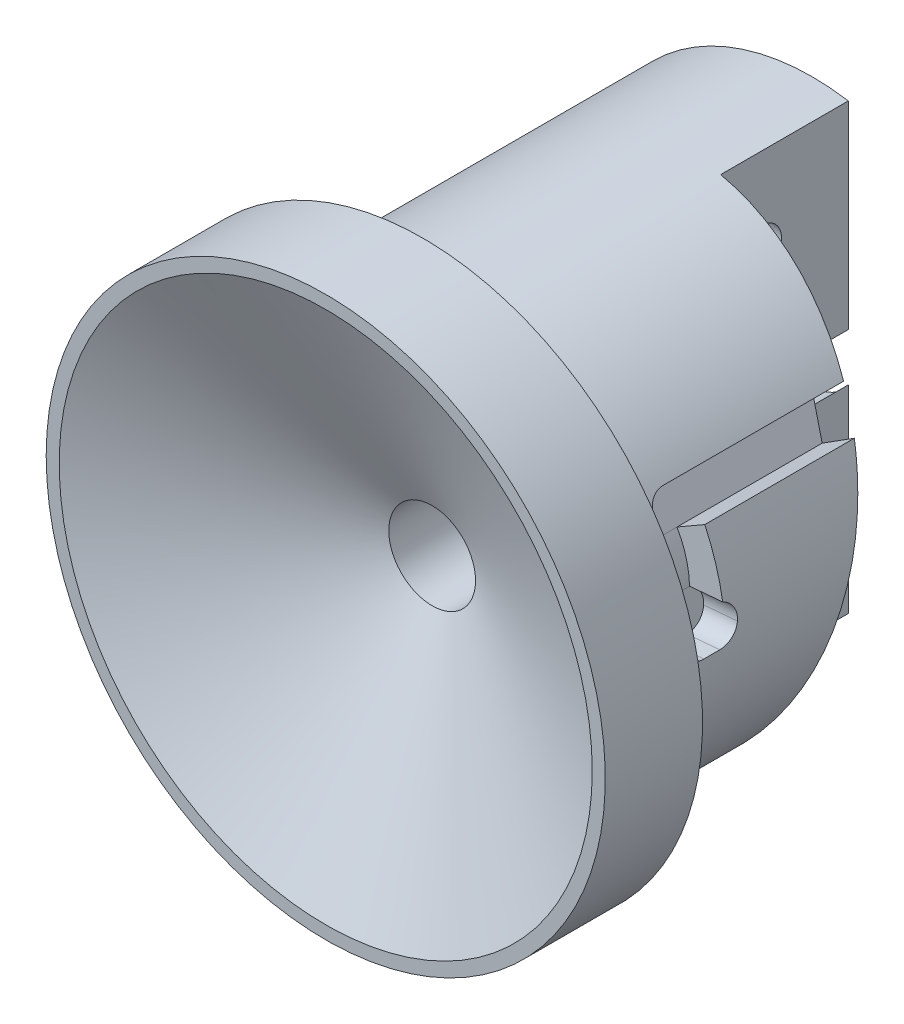
ISO-10303-21;
HEADER;
FILE_DESCRIPTION(('STEP AP214'),'2;1');
FILE_NAME('part.step','',(''),(''),'','','');
FILE_SCHEMA(('AUTOMOTIVE_DESIGN { 1 0 10303 214 1 1 1 1 }'));
ENDSEC;
DATA;
#1=APPLICATION_CONTEXT('core data for automotive mechanical design processes');
#2=APPLICATION_PROTOCOL_DEFINITION('international standard','automotive_design',2000,#1);
#3=PRODUCT_CONTEXT('',#1,'mechanical');
#4=PRODUCT('Part','Part','',(#3));
#5=PRODUCT_RELATED_PRODUCT_CATEGORY('part','',(#4));
#6=PRODUCT_DEFINITION_FORMATION('','',#4);
#7=PRODUCT_DEFINITION_CONTEXT('part definition',#1,'design');
#8=PRODUCT_DEFINITION('design','',#6,#7);
#9=PRODUCT_DEFINITION_SHAPE('','',#8);
#10=(LENGTH_UNIT() NAMED_UNIT(*) SI_UNIT(.MILLI.,.METRE.));
#11=(NAMED_UNIT(*) PLANE_ANGLE_UNIT() SI_UNIT($,.RADIAN.));
#12=(NAMED_UNIT(*) SI_UNIT($,.STERADIAN.) SOLID_ANGLE_UNIT());
#13=UNCERTAINTY_MEASURE_WITH_UNIT(LENGTH_MEASURE(1.E-05),#10,'distance_accuracy_value','');
#14=(GEOMETRIC_REPRESENTATION_CONTEXT(3) GLOBAL_UNCERTAINTY_ASSIGNED_CONTEXT((#13)) GLOBAL_UNIT_ASSIGNED_CONTEXT((#10,
#11,#12)) REPRESENTATION_CONTEXT('',''));
#15=CARTESIAN_POINT('',(0.,0.,0.));
#16=DIRECTION('',(0.,0.,1.));
#17=DIRECTION('',(1.,0.,0.));
#18=AXIS2_PLACEMENT_3D('',#15,#16,#17);
#19=CARTESIAN_POINT('',(12.4163792441114,1.08629242589841,-11.43));
#20=DIRECTION('',(-0.996194698091745,-0.0871557427476648,0.));
#21=DIRECTION('',(0.0871557427476648,-0.996194698091745,0.));
#22=AXIS2_PLACEMENT_3D('',#19,#20,#21);
#23=PLANE('',#22);
#24=DIRECTION('',(0.,0.,1.));
#25=VECTOR('',#24,1.);
#26=CARTESIAN_POINT('',(12.5303876711996,-0.216829858675404,-11.43));
#27=LINE('',#26,#25);
#28=CARTESIAN_POINT('',(12.5303876711996,-0.216829858675404,-11.0477431507776));
#29=VERTEX_POINT('',#28);
#30=CARTESIAN_POINT('',(12.5303876711996,-0.216829858675404,-10.0076));
#31=VERTEX_POINT('',#30);
#32=EDGE_CURVE('E189',#29,#31,#27,.T.);
#33=ORIENTED_EDGE('',*,*,#32,.F.);
#34=CARTESIAN_POINT('',(12.4263411455075,0.972427371906513,-11.0477431507776));
#35=DIRECTION('',(-0.996194698091745,-0.0871557427476648,0.));
#36=DIRECTION('',(0.0871557427476648,-0.996194698091745,0.));
#37=AXIS2_PLACEMENT_3D('',#34,#35,#36);
#38=CIRCLE('',#37,1.1938);
#39=CARTESIAN_POINT('',(12.4417284972035,0.796549137220463,-12.2284160588988));
#40=VERTEX_POINT('',#39);
#41=EDGE_CURVE('E62',#29,#40,#38,.F.);
#42=ORIENTED_EDGE('',*,*,#41,.T.);
#43=CARTESIAN_POINT('',(12.4248678884302,0.989266777355177,-10.9347));
#44=DIRECTION('',(0.996194698091745,0.0871557427476654,0.));
#45=DIRECTION('',(-0.0871557427476654,0.996194698091745,0.));
#46=AXIS2_PLACEMENT_3D('',#43,#44,#45);
#47=CIRCLE('',#46,1.3081);
#48=CARTESIAN_POINT('',(12.3193481056608,2.19536341338579,-11.43));
#49=VERTEX_POINT('',#48);
#50=EDGE_CURVE('E182',#40,#49,#47,.T.);
#51=ORIENTED_EDGE('',*,*,#50,.T.);
#52=DIRECTION('',(0.,0.,-1.));
#53=VECTOR('',#52,1.);
#54=CARTESIAN_POINT('',(12.3193481056608,2.19536341338579,-4.98224669027091));
#55=LINE('',#54,#53);
#56=CARTESIAN_POINT('',(12.3193481056608,2.19536341338579,-8.8138));
#57=VERTEX_POINT('',#56);
#58=EDGE_CURVE('E675',#57,#49,#55,.T.);
#59=ORIENTED_EDGE('',*,*,#58,.F.);
#60=DIRECTION('',(0.0871557427476648,-0.996194698091745,0.));
#61=VECTOR('',#60,1.);
#62=CARTESIAN_POINT('',(12.4163792441114,1.08629242589841,-8.8138));
#63=LINE('',#62,#61);
#64=CARTESIAN_POINT('',(12.4263411455075,0.972427371906522,-8.8138));
#65=VERTEX_POINT('',#64);
#66=EDGE_CURVE('E172',#57,#65,#63,.T.);
#67=ORIENTED_EDGE('',*,*,#66,.T.);
#68=CARTESIAN_POINT('',(12.4263411455075,0.972427371906522,-10.0076));
#69=DIRECTION('',(-0.996194698091745,-0.0871557427476648,0.));
#70=DIRECTION('',(0.0871557427476648,-0.996194698091745,0.));
#71=AXIS2_PLACEMENT_3D('',#68,#69,#70);
#72=CIRCLE('',#71,1.1938);
#73=EDGE_CURVE('E326',#65,#31,#72,.F.);
#74=ORIENTED_EDGE('',*,*,#73,.T.);
#75=EDGE_LOOP('',(#33,#42,#51,#59,#67,#74));
#76=FACE_BOUND('',#75,.T.);
#77=ADVANCED_FACE('F47',(#76),#23,.F.);
#78=CARTESIAN_POINT('',(0.,0.,-0.325495880631441));
#79=DIRECTION('',(0.,0.,-1.));
#80=DIRECTION('',(-1.,0.,0.));
#81=AXIS2_PLACEMENT_3D('',#78,#79,#80);
#82=CYLINDRICAL_SURFACE('',#81,14.6812);
#83=CARTESIAN_POINT('',(0.,0.,-6.35));
#84=DIRECTION('',(0.,0.,-1.));
#85=DIRECTION('',(-1.,0.,0.));
#86=AXIS2_PLACEMENT_3D('',#83,#84,#85);
#87=CIRCLE('',#86,14.6812);
#88=CARTESIAN_POINT('',(-14.6812,0.,-6.35));
#89=VERTEX_POINT('',#88);
#90=EDGE_CURVE('E273',#89,#89,#87,.T.);
#91=ORIENTED_EDGE('',*,*,#90,.T.);
#92=EDGE_LOOP('',(#91));
#93=FACE_BOUND('',#92,.T.);
#94=CARTESIAN_POINT('',(0.,0.,-11.43));
#95=DIRECTION('',(0.,0.,-1.));
#96=DIRECTION('',(-1.,0.,0.));
#97=AXIS2_PLACEMENT_3D('',#94,#95,#96);
#98=CIRCLE('',#97,14.6812);
#99=CARTESIAN_POINT('',(13.3177730257338,6.17855606715985,-11.43));
#100=VERTEX_POINT('',#99);
#101=CARTESIAN_POINT('',(14.4861901964781,2.3849375319831,-11.43));
#102=VERTEX_POINT('',#101);
#103=EDGE_CURVE('E177',#100,#102,#98,.T.);
#104=ORIENTED_EDGE('',*,*,#103,.T.);
#105=CARTESIAN_POINT('',(14.4861901964781,2.3849375319831,-11.43));
#106=CARTESIAN_POINT('',(14.4884613639518,2.37113892146036,-11.4640839324803));
#107=CARTESIAN_POINT('',(14.4909469978515,2.35592163119562,-11.4975599355647));
#108=CARTESIAN_POINT('',(14.4963016066078,2.32274827648895,-11.5630917175754));
#109=CARTESIAN_POINT('',(14.4991705585478,2.30479237576407,-11.5951475812514));
#110=CARTESIAN_POINT('',(14.5082748069592,2.24702314199613,-11.6887851744347));
#111=CARTESIAN_POINT('',(14.5150150036987,2.2032637948891,-11.7479464938295));
#112=CARTESIAN_POINT('',(14.5293750070234,2.10648592639315,-11.8580031221646));
#113=CARTESIAN_POINT('',(14.5369951813185,2.0534635295405,-11.9088949540572));
#114=CARTESIAN_POINT('',(14.5526203993969,1.93963040528132,-12.0009804680014));
#115=CARTESIAN_POINT('',(14.5606253725657,1.87882110346975,-12.0421759213184));
#116=CARTESIAN_POINT('',(14.576537633485,1.75109152865624,-12.1137040439891));
#117=CARTESIAN_POINT('',(14.5844449014716,1.68417004152981,-12.1440345492142));
#118=CARTESIAN_POINT('',(14.5997272511608,1.54609767566489,-12.1929541419579));
#119=CARTESIAN_POINT('',(14.607102277394,1.47494635750507,-12.2115420072372));
#120=CARTESIAN_POINT('',(14.6209501884581,1.33066995216013,-12.2363920347503));
#121=CARTESIAN_POINT('',(14.6274258299262,1.25755175459766,-12.2426926683214));
#122=CARTESIAN_POINT('',(14.6392703996066,1.11120858960278,-12.2429046032492));
#123=CARTESIAN_POINT('',(14.6446393414138,1.03798362349305,-12.2368160568067));
#124=CARTESIAN_POINT('',(14.6541548947385,0.893645242462607,-12.2124528028116));
#125=CARTESIAN_POINT('',(14.6583036793869,0.822528278854515,-12.1941999519649));
#126=CARTESIAN_POINT('',(14.6654071916949,0.684294374417719,-12.1460628447409));
#127=CARTESIAN_POINT('',(14.6683620518004,0.61717699060737,-12.1161798792521));
#128=CARTESIAN_POINT('',(14.6732064954826,0.488666124884252,-12.0455416585469));
#129=CARTESIAN_POINT('',(14.6750933912915,0.427287406482897,-12.0047593487301));
#130=CARTESIAN_POINT('',(14.6779937408499,0.312178358820198,-11.9135124207659));
#131=CARTESIAN_POINT('',(14.6790070080101,0.258449665492134,-11.8630457370473));
#132=CARTESIAN_POINT('',(14.6804218904452,0.159245895251082,-11.7527841678264));
#133=CARTESIAN_POINT('',(14.680811807414,0.113942466276904,-11.692833569748));
#134=CARTESIAN_POINT('',(14.6811136624675,0.0541648994216365,-11.5978162464266));
#135=CARTESIAN_POINT('',(14.6811670302523,0.0355888327049288,-11.5652633572206));
#136=CARTESIAN_POINT('',(14.6812098056202,0.00129355360213024,-11.498683736804));
#137=CARTESIAN_POINT('',(14.6811992098185,-0.014425507549017,-11.4646569276898));
#138=CARTESIAN_POINT('',(14.6811720243797,-0.028660610083196,-11.43));
#139=B_SPLINE_CURVE_WITH_KNOTS('',3,(#105,#106,#107,#108,#109,#110,#111,#112,#113,#114,#115,
#116,#117,#118,#119,#120,#121,#122,#123,#124,#125,#126,#127,#128,#129,#130,#131,#132,#133,#134,
#135,#136,#137,#138),.UNSPECIFIED.,.F.,.F.,(4,2,2,2,2,2,2,2,2,2,2,2,2,2,2,2,4),(0.,
0.110455309405497,0.22090401826105,0.441450437625067,0.662089350884358,0.882687928062333,
1.10333042064266,1.3239958751392,1.5439693094908,1.76394004148966,1.98351659398571,
2.20306878145643,2.42317109112525,2.64332039849976,2.86755466092752,2.97987594788759,
3.09220317881903),.UNSPECIFIED.);
#140=CARTESIAN_POINT('',(14.6478125129356,0.989556479382784,-12.2284160588988));
#141=VERTEX_POINT('',#140);
#142=EDGE_CURVE('E162',#102,#141,#139,.T.);
#143=ORIENTED_EDGE('',*,*,#142,.T.);
#144=CARTESIAN_POINT('',(14.6478125129356,0.989556479382784,-12.2284160588988));
#145=CARTESIAN_POINT('',(14.6500520617752,0.956414885802688,-12.2234497719461));
#146=CARTESIAN_POINT('',(14.6521625740862,0.923490699329103,-12.2170844377252));
#147=CARTESIAN_POINT('',(14.6561266797544,0.858282230564713,-12.2016024279582));
#148=CARTESIAN_POINT('',(14.6579802900503,0.825997906205256,-12.1924859339349));
#149=CARTESIAN_POINT('',(14.6631521672888,0.730511927722907,-12.1611134422584));
#150=CARTESIAN_POINT('',(14.6660889302212,0.668565530487546,-12.1348175692463));
#151=CARTESIAN_POINT('',(14.6710176288004,0.549922268249114,-12.0722187251337));
#152=CARTESIAN_POINT('',(14.6730091760995,0.493227568624937,-12.0359116505367));
#153=CARTESIAN_POINT('',(14.6762031903628,0.38669701296365,-11.9543239944428));
#154=CARTESIAN_POINT('',(14.6774058468479,0.336859511848389,-11.9090455716021));
#155=CARTESIAN_POINT('',(14.6792209558788,0.245374594432259,-11.8106954776694));
#156=CARTESIAN_POINT('',(14.6798323334249,0.203742204744798,-11.7576098133281));
#157=CARTESIAN_POINT('',(14.680671372986,0.129958071030313,-11.6451657160257));
#158=CARTESIAN_POINT('',(14.680898820731,0.0978116293300162,-11.5858037999342));
#159=CARTESIAN_POINT('',(14.6811588607807,0.043971541156054,-11.4625272929247));
#160=CARTESIAN_POINT('',(14.681191469244,0.0222770279981484,-11.3986130799922));
#161=CARTESIAN_POINT('',(14.6812059558936,-0.00998039306510226,-11.268137439148));
#162=CARTESIAN_POINT('',(14.6811879344012,-0.0205652571984908,-11.2015815034751));
#163=CARTESIAN_POINT('',(14.6811735472856,-0.0276040131707234,-11.1057329463568));
#164=CARTESIAN_POINT('',(14.6811706958382,-0.0286684031172335,-11.0767298307041));
#165=CARTESIAN_POINT('',(14.6811720243797,-0.0286606100832027,-11.0477431507776));
#166=B_SPLINE_CURVE_WITH_KNOTS('',3,(#144,#145,#146,#147,#148,#149,#150,#151,#152,#153,#154,
#155,#156,#157,#158,#159,#160,#161,#162,#163,#164,#165),.UNSPECIFIED.,.F.,.F.,(4,2,2,2,2,2,2,2,
2,2,4),(0.,0.100696848378733,0.201387054188759,0.402432056561508,0.603559588185072,
0.804638783804235,1.00608287651422,1.20763935734326,1.40917912203195,1.61031982519953,
1.69730434377564),.UNSPECIFIED.);
#167=CARTESIAN_POINT('',(14.6811720243797,-0.0286606100831969,-11.0477431507776));
#168=VERTEX_POINT('',#167);
#169=EDGE_CURVE('E13',#141,#168,#166,.T.);
#170=ORIENTED_EDGE('',*,*,#169,.T.);
#171=DIRECTION('',(0.,0.,1.));
#172=VECTOR('',#171,1.);
#173=CARTESIAN_POINT('',(14.6811720243797,-0.0286606100831969,-11.43));
#174=LINE('',#173,#172);
#175=CARTESIAN_POINT('',(14.6811720243797,-0.0286606100831969,-10.0076));
#176=VERTEX_POINT('',#175);
#177=EDGE_CURVE('E194',#168,#176,#174,.T.);
#178=ORIENTED_EDGE('',*,*,#177,.T.);
#179=CARTESIAN_POINT('',(14.6811720243797,-0.0286606100831969,-10.0076));
#180=CARTESIAN_POINT('',(14.6811713603819,-0.0286605230438289,-9.97408563546251));
#181=CARTESIAN_POINT('',(14.6811748663989,-0.0272427717737959,-9.94058738885749));
#182=CARTESIAN_POINT('',(14.6811845304353,-0.0215876829205685,-9.8738318693208));
#183=CARTESIAN_POINT('',(14.68119068829,-0.0173505205160749,-9.84057458154739));
#184=CARTESIAN_POINT('',(14.6812045930233,-0.000453664150254155,-9.74159048510479));
#185=CARTESIAN_POINT('',(14.6812078098013,0.0163915308899458,-9.67652869935269));
#186=CARTESIAN_POINT('',(14.6810908383812,0.0607567027563818,-9.55016116036319));
#187=CARTESIAN_POINT('',(14.6809705991541,0.0882810907647501,-9.48885697138397));
#188=CARTESIAN_POINT('',(14.6804363890432,0.153200837694031,-9.37172124193255));
#189=CARTESIAN_POINT('',(14.6800224525708,0.190595039879959,-9.31588906119583));
#190=CARTESIAN_POINT('',(14.6786972688968,0.274281353774743,-9.21113424513901));
#191=CARTESIAN_POINT('',(14.6777848159165,0.320594862330806,-9.16222872618486));
#192=CARTESIAN_POINT('',(14.6752549436024,0.42074894096606,-9.07284954191489));
#193=CARTESIAN_POINT('',(14.6736373854947,0.474590991341006,-9.03237753874161));
#194=CARTESIAN_POINT('',(14.6695155823306,0.588380160054187,-8.96094395595983));
#195=CARTESIAN_POINT('',(14.6670094195741,0.648340280904667,-8.93000321783209));
#196=CARTESIAN_POINT('',(14.6609910764105,0.772547009819359,-8.87865031721457));
#197=CARTESIAN_POINT('',(14.6574795068623,0.836790996991481,-8.85823178273492));
#198=CARTESIAN_POINT('',(14.6507889416689,0.945461627073592,-8.83354305630054));
#199=CARTESIAN_POINT('',(14.6479009496125,0.989221128629121,-8.82614487763141));
#200=CARTESIAN_POINT('',(14.6416949748365,1.07720193868941,-8.81627361018692));
#201=CARTESIAN_POINT('',(14.6383775752617,1.12142254745402,-8.81379391522364));
#202=CARTESIAN_POINT('',(14.6348522499863,1.16564705681955,-8.8138));
#203=B_SPLINE_CURVE_WITH_KNOTS('',3,(#179,#180,#181,#182,#183,#184,#185,#186,#187,#188,#189,
#190,#191,#192,#193,#194,#195,#196,#197,#198,#199,#200,#201,#202),.UNSPECIFIED.,.F.,.F.,(4,2,2,
2,2,2,2,2,2,2,2,4),(0.,0.10048113671173,0.200956030803738,0.401542288075423,0.602211488518851,
0.8028571811141,1.00399034458768,1.20516311152662,1.40677269924674,1.60826005322121,
1.74142420625145,1.87440938039694),.UNSPECIFIED.);
#204=CARTESIAN_POINT('',(14.6348522499863,1.16564705681955,-8.8138));
#205=VERTEX_POINT('',#204);
#206=EDGE_CURVE('E338',#176,#205,#203,.T.);
#207=ORIENTED_EDGE('',*,*,#206,.T.);
#208=CARTESIAN_POINT('',(0.,0.,-8.8138));
#209=DIRECTION('',(0.,0.,-1.));
#210=DIRECTION('',(-1.,0.,0.));
#211=AXIS2_PLACEMENT_3D('',#208,#209,#210);
#212=CIRCLE('',#211,14.6812);
#213=CARTESIAN_POINT('',(12.6567568233372,7.43936423055812,-8.8138));
#214=VERTEX_POINT('',#213);
#215=EDGE_CURVE('E208',#205,#214,#212,.F.);
#216=ORIENTED_EDGE('',*,*,#215,.T.);
#217=CARTESIAN_POINT('',(12.6567568233372,7.43936423055812,-8.8138));
#218=CARTESIAN_POINT('',(12.6397597788737,7.46828295212252,-8.81380015810687));
#219=CARTESIAN_POINT('',(12.6226705774063,7.49712876306233,-8.8152145949507));
#220=CARTESIAN_POINT('',(12.5884195945533,7.55449792981282,-8.82085647503839));
#221=CARTESIAN_POINT('',(12.5712578177808,7.58302130570696,-8.82508374208702));
#222=CARTESIAN_POINT('',(12.5198894231226,7.66774696235313,-8.84194156904666));
#223=CARTESIAN_POINT('',(12.4857380361821,7.72320965707814,-8.8587482841184));
#224=CARTESIAN_POINT('',(12.4187154652752,7.83052717895543,-8.90302146476721));
#225=CARTESIAN_POINT('',(12.3858448136072,7.88238051288315,-8.93049231164126));
#226=CARTESIAN_POINT('',(12.322454656725,7.98111440689049,-8.99530765608452));
#227=CARTESIAN_POINT('',(12.2919348705147,8.02799556154164,-9.03265097123783));
#228=CARTESIAN_POINT('',(12.2342228425561,8.11567569488978,-9.11625205562751));
#229=CARTESIAN_POINT('',(12.2070382409144,8.15646075385226,-9.16252968986431));
#230=CARTESIAN_POINT('',(12.1570375594092,8.23080088923721,-9.26265484131266));
#231=CARTESIAN_POINT('',(12.1342223196209,8.26435457547542,-9.31650381078207));
#232=CARTESIAN_POINT('',(12.0937823150095,8.32342180353166,-9.43031977384777));
#233=CARTESIAN_POINT('',(12.0761645636817,8.34892448453775,-9.49029488857362));
#234=CARTESIAN_POINT('',(12.0468408632733,8.39118133972652,-9.61459598954198));
#235=CARTESIAN_POINT('',(12.0351312922353,8.40794087403206,-9.6789192826759));
#236=CARTESIAN_POINT('',(12.0209857473769,8.4281451550881,-9.7876294569824));
#237=CARTESIAN_POINT('',(12.0167485960115,8.43418213385462,-9.83132608869502));
#238=CARTESIAN_POINT('',(12.0110913581152,8.44223457874028,-9.91920886554014));
#239=CARTESIAN_POINT('',(12.0096674778834,8.44425546059445,-9.96339427054197));
#240=CARTESIAN_POINT('',(12.0096730257338,8.4442517285407,-10.0076));
#241=B_SPLINE_CURVE_WITH_KNOTS('',3,(#217,#218,#219,#220,#221,#222,#223,#224,#225,#226,#227,
#228,#229,#230,#231,#232,#233,#234,#235,#236,#237,#238,#239,#240),.UNSPECIFIED.,.F.,.F.,(4,2,2,
2,2,2,2,2,2,2,2,4),(0.,0.100569590039991,0.201132881010322,0.401899054356789,0.60274779877107,
0.80357249861645,1.00484897434578,1.20616410971808,1.40774967022183,1.6092114998785,
1.74189925108982,1.87440795018741),.UNSPECIFIED.);
#242=CARTESIAN_POINT('',(12.0096730257338,8.4442517285407,-10.0076));
#243=VERTEX_POINT('',#242);
#244=EDGE_CURVE('E330',#214,#243,#241,.T.);
#245=ORIENTED_EDGE('',*,*,#244,.T.);
#246=DIRECTION('',(0.,0.,-1.));
#247=VECTOR('',#246,1.);
#248=CARTESIAN_POINT('',(12.0096730257338,8.4442517285407,-1.79195968761566));
#249=LINE('',#248,#247);
#250=CARTESIAN_POINT('',(12.0096730257338,8.4442517285407,-21.7988693357249));
#251=VERTEX_POINT('',#250);
#252=EDGE_CURVE('E209',#243,#251,#249,.T.);
#253=ORIENTED_EDGE('',*,*,#252,.T.);
#254=CARTESIAN_POINT('',(0.,0.,-19.5362389043773));
#255=DIRECTION('',(0.,0.258819045102521,0.965925826289068));
#256=DIRECTION('',(0.,0.965925826289068,-0.258819045102521));
#257=AXIS2_PLACEMENT_3D('',#254,#255,#256);
#258=ELLIPSE('',#257,15.1990966598365,14.6812);
#259=CARTESIAN_POINT('',(2.3622,14.4899152723541,-23.4188));
#260=VERTEX_POINT('',#259);
#261=EDGE_CURVE('E289',#260,#251,#258,.F.);
#262=ORIENTED_EDGE('',*,*,#261,.F.);
#263=DIRECTION('',(0.,0.,-1.));
#264=VECTOR('',#263,1.);
#265=CARTESIAN_POINT('',(2.3622,14.4899152723541,-23.4188));
#266=LINE('',#265,#264);
#267=CARTESIAN_POINT('',(2.3622,14.4899152723541,-31.75));
#268=VERTEX_POINT('',#267);
#269=EDGE_CURVE('E240',#260,#268,#266,.T.);
#270=ORIENTED_EDGE('',*,*,#269,.T.);
#271=CARTESIAN_POINT('',(0.,0.,-31.75));
#272=DIRECTION('',(0.,0.,-1.));
#273=DIRECTION('',(-1.,0.,0.));
#274=AXIS2_PLACEMENT_3D('',#271,#272,#273);
#275=CIRCLE('',#274,14.6812);
#276=CARTESIAN_POINT('',(2.3622,-14.4899152723541,-31.75));
#277=VERTEX_POINT('',#276);
#278=EDGE_CURVE('E277',#277,#268,#275,.T.);
#279=ORIENTED_EDGE('',*,*,#278,.F.);
#280=DIRECTION('',(0.,0.,1.));
#281=VECTOR('',#280,1.);
#282=CARTESIAN_POINT('',(2.3622,-14.4899152723541,-31.75));
#283=LINE('',#282,#281);
#284=CARTESIAN_POINT('',(2.3622,-14.4899152723541,-15.6536778087546));
#285=VERTEX_POINT('',#284);
#286=EDGE_CURVE('E231',#277,#285,#283,.T.);
#287=ORIENTED_EDGE('',*,*,#286,.T.);
#288=CARTESIAN_POINT('',(13.3177730257338,6.17855606715985,-21.1917780129632));
#289=VERTEX_POINT('',#288);
#290=EDGE_CURVE('E285',#289,#285,#258,.F.);
#291=ORIENTED_EDGE('',*,*,#290,.F.);
#292=DIRECTION('',(0.,0.,-1.));
#293=VECTOR('',#292,1.);
#294=CARTESIAN_POINT('',(13.3177730257338,6.17855606715985,-1.79195968761566));
#295=LINE('',#294,#293);
#296=EDGE_CURVE('E187',#100,#289,#295,.T.);
#297=ORIENTED_EDGE('',*,*,#296,.F.);
#298=EDGE_LOOP('',(#104,#143,#170,#178,#207,#216,#245,#253,#262,#270,#279,#287,#291,#297));
#299=FACE_BOUND('',#298,.T.);
#300=ADVANCED_FACE('F185',(#93,#299),#82,.T.);
#301=CARTESIAN_POINT('',(0.,0.,-11.43));
#302=DIRECTION('',(0.,0.,-1.));
#303=DIRECTION('',(-1.,0.,0.));
#304=AXIS2_PLACEMENT_3D('',#301,#302,#303);
#305=PLANE('',#304);
#306=CARTESIAN_POINT('',(6.18343536424458,2.05954429780938,-11.43));
#307=DIRECTION('',(0.,0.,1.));
#308=DIRECTION('',(1.,0.,0.));
#309=AXIS2_PLACEMENT_3D('',#306,#307,#308);
#310=CIRCLE('',#309,6.13741574300042);
#311=CARTESIAN_POINT('',(11.4985933112695,5.12825216930959,-11.43));
#312=VERTEX_POINT('',#311);
#313=EDGE_CURVE('E180',#49,#312,#310,.T.);
#314=ORIENTED_EDGE('',*,*,#313,.F.);
#315=DIRECTION('',(-0.996194698091745,-0.0871557427476654,0.));
#316=VECTOR('',#315,1.);
#317=CARTESIAN_POINT('',(19.5987713062001,2.8322304204406,-11.43));
#318=LINE('',#317,#316);
#319=EDGE_CURVE('E166',#102,#49,#318,.T.);
#320=ORIENTED_EDGE('',*,*,#319,.F.);
#321=ORIENTED_EDGE('',*,*,#103,.F.);
#322=DIRECTION('',(0.866025403784438,0.500000000000001,0.));
#323=VECTOR('',#322,1.);
#324=CARTESIAN_POINT('',(13.3177730257338,6.17855606715985,-11.43));
#325=LINE('',#324,#323);
#326=EDGE_CURVE('E305',#312,#100,#325,.T.);
#327=ORIENTED_EDGE('',*,*,#326,.F.);
#328=EDGE_LOOP('',(#314,#320,#321,#327));
#329=FACE_BOUND('',#328,.T.);
#330=ADVANCED_FACE('F176',(#329),#305,.F.);
#331=CARTESIAN_POINT('',(0.,0.,-0.325495880631441));
#332=DIRECTION('',(0.,0.,-1.));
#333=DIRECTION('',(-1.,0.,0.));
#334=AXIS2_PLACEMENT_3D('',#331,#332,#333);
#335=CYLINDRICAL_SURFACE('',#334,2.8321);
#336=CARTESIAN_POINT('',(0.,0.,-6.94745435036496));
#337=DIRECTION('',(0.,0.,1.));
#338=DIRECTION('',(1.,0.,0.));
#339=AXIS2_PLACEMENT_3D('',#336,#337,#338);
#340=CIRCLE('',#339,2.8321);
#341=CARTESIAN_POINT('',(2.8321,0.,-6.94745435036496));
#342=VERTEX_POINT('',#341);
#343=EDGE_CURVE('E264',#342,#342,#340,.F.);
#344=ORIENTED_EDGE('',*,*,#343,.F.);
#345=EDGE_LOOP('',(#344));
#346=FACE_BOUND('',#345,.T.);
#347=CARTESIAN_POINT('',(0.,0.,-19.5362389043773));
#348=DIRECTION('',(0.,0.258819045102521,0.965925826289068));
#349=DIRECTION('',(0.,0.965925826289068,-0.258819045102521));
#350=AXIS2_PLACEMENT_3D('',#347,#348,#349);
#351=ELLIPSE('',#350,2.9320056705394,2.8321);
#352=CARTESIAN_POINT('',(2.3622,-1.56230649041729,-19.1176201419401));
#353=VERTEX_POINT('',#352);
#354=CARTESIAN_POINT('',(2.3622,1.56230649041729,-19.9548576668145));
#355=VERTEX_POINT('',#354);
#356=EDGE_CURVE('E257',#353,#355,#351,.T.);
#357=ORIENTED_EDGE('',*,*,#356,.F.);
#358=DIRECTION('',(0.,0.,-1.));
#359=VECTOR('',#358,1.);
#360=CARTESIAN_POINT('',(2.3622,-1.56230649041729,-0.325495880631441));
#361=LINE('',#360,#359);
#362=CARTESIAN_POINT('',(2.3622,-1.56230649041728,-31.75));
#363=VERTEX_POINT('',#362);
#364=EDGE_CURVE('E253',#353,#363,#361,.T.);
#365=ORIENTED_EDGE('',*,*,#364,.T.);
#366=CARTESIAN_POINT('',(0.,0.,-31.75));
#367=DIRECTION('',(0.,0.,-1.));
#368=DIRECTION('',(-1.,0.,0.));
#369=AXIS2_PLACEMENT_3D('',#366,#367,#368);
#370=CIRCLE('',#369,2.8321);
#371=CARTESIAN_POINT('',(2.3622,1.5623064904173,-31.75));
#372=VERTEX_POINT('',#371);
#373=EDGE_CURVE('E281',#363,#372,#370,.T.);
#374=ORIENTED_EDGE('',*,*,#373,.T.);
#375=DIRECTION('',(0.,0.,-1.));
#376=VECTOR('',#375,1.);
#377=CARTESIAN_POINT('',(2.3622,1.56230649041729,-0.325495880631441));
#378=LINE('',#377,#376);
#379=EDGE_CURVE('E249',#372,#355,#378,.F.);
#380=ORIENTED_EDGE('',*,*,#379,.T.);
#381=EDGE_LOOP('',(#357,#365,#374,#380));
#382=FACE_BOUND('',#381,.T.);
#383=ADVANCED_FACE('F361',(#346,#382),#335,.F.);
#384=CARTESIAN_POINT('',(0.,2.8321,-31.75));
#385=DIRECTION('',(0.,0.,-1.));
#386=DIRECTION('',(-1.,0.,0.));
#387=AXIS2_PLACEMENT_3D('',#384,#385,#386);
#388=PLANE('',#387);
#389=ORIENTED_EDGE('',*,*,#278,.T.);
#390=DIRECTION('',(0.,-1.,0.));
#391=VECTOR('',#390,1.);
#392=CARTESIAN_POINT('',(2.3622,14.4899152723541,-31.75));
#393=LINE('',#392,#391);
#394=EDGE_CURVE('E245',#268,#372,#393,.T.);
#395=ORIENTED_EDGE('',*,*,#394,.T.);
#396=ORIENTED_EDGE('',*,*,#373,.F.);
#397=EDGE_CURVE('E244',#363,#277,#393,.T.);
#398=ORIENTED_EDGE('',*,*,#397,.T.);
#399=EDGE_LOOP('',(#389,#395,#396,#398));
#400=FACE_BOUND('',#399,.T.);
#401=ADVANCED_FACE('F354',(#400),#388,.T.);
#402=CARTESIAN_POINT('',(0.,18.2499,0.));
#403=DIRECTION('',(0.,0.,1.));
#404=DIRECTION('',(1.,0.,0.));
#405=AXIS2_PLACEMENT_3D('',#402,#403,#404);
#406=PLANE('',#405);
#407=CARTESIAN_POINT('',(0.,0.,0.));
#408=DIRECTION('',(0.,0.,-1.));
#409=DIRECTION('',(-1.,0.,0.));
#410=AXIS2_PLACEMENT_3D('',#407,#408,#409);
#411=CIRCLE('',#410,17.399);
#412=CARTESIAN_POINT('',(17.399,0.,0.));
#413=VERTEX_POINT('',#412);
#414=EDGE_CURVE('E260',#413,#413,#411,.T.);
#415=ORIENTED_EDGE('',*,*,#414,.T.);
#416=EDGE_LOOP('',(#415));
#417=FACE_BOUND('',#416,.T.);
#418=CARTESIAN_POINT('',(0.,0.,0.));
#419=DIRECTION('',(0.,0.,-1.));
#420=DIRECTION('',(-1.,0.,0.));
#421=AXIS2_PLACEMENT_3D('',#418,#419,#420);
#422=CIRCLE('',#421,18.2499);
#423=CARTESIAN_POINT('',(-18.2499,0.,0.));
#424=VERTEX_POINT('',#423);
#425=EDGE_CURVE('E265',#424,#424,#422,.T.);
#426=ORIENTED_EDGE('',*,*,#425,.F.);
#427=EDGE_LOOP('',(#426));
#428=FACE_BOUND('',#427,.T.);
#429=ADVANCED_FACE('F360',(#417,#428),#406,.T.);
#430=CARTESIAN_POINT('',(0.,14.6812,-6.35));
#431=DIRECTION('',(0.,0.,-1.));
#432=DIRECTION('',(-1.,0.,0.));
#433=AXIS2_PLACEMENT_3D('',#430,#431,#432);
#434=PLANE('',#433);
#435=CARTESIAN_POINT('',(0.,0.,-6.35));
#436=DIRECTION('',(0.,0.,-1.));
#437=DIRECTION('',(-1.,0.,0.));
#438=AXIS2_PLACEMENT_3D('',#435,#436,#437);
#439=CIRCLE('',#438,18.2499);
#440=CARTESIAN_POINT('',(-18.2499,0.,-6.35));
#441=VERTEX_POINT('',#440);
#442=EDGE_CURVE('E269',#441,#441,#439,.T.);
#443=ORIENTED_EDGE('',*,*,#442,.T.);
#444=EDGE_LOOP('',(#443));
#445=FACE_BOUND('',#444,.T.);
#446=ORIENTED_EDGE('',*,*,#90,.F.);
#447=EDGE_LOOP('',(#446));
#448=FACE_BOUND('',#447,.T.);
#449=ADVANCED_FACE('F352',(#445,#448),#434,.T.);
#450=CARTESIAN_POINT('',(0.,0.,-0.325495880631441));
#451=DIRECTION('',(0.,0.,-1.));
#452=DIRECTION('',(-1.,0.,0.));
#453=AXIS2_PLACEMENT_3D('',#450,#451,#452);
#454=CYLINDRICAL_SURFACE('',#453,18.2499);
#455=ORIENTED_EDGE('',*,*,#425,.T.);
#456=EDGE_LOOP('',(#455));
#457=FACE_BOUND('',#456,.T.);
#458=ORIENTED_EDGE('',*,*,#442,.F.);
#459=EDGE_LOOP('',(#458));
#460=FACE_BOUND('',#459,.T.);
#461=ADVANCED_FACE('F370',(#457,#460),#454,.T.);
#462=CARTESIAN_POINT('',(0.,0.,-8.29818));
#463=DIRECTION('',(0.,0.,1.));
#464=DIRECTION('',(1.,0.,0.));
#465=AXIS2_PLACEMENT_3D('',#462,#463,#464);
#466=CONICAL_SURFACE('',#465,0.,1.12577095336052);
#467=CARTESIAN_POINT('',(2.8321,0.,-6.94745435036496));
#468=CARTESIAN_POINT('',(2.98383854166667,0.,-6.87508503421533));
#469=CARTESIAN_POINT('',(3.13557708333333,0.,-6.80271571806569));
#470=CARTESIAN_POINT('',(3.43905416666667,0.,-6.65797708576642));
#471=CARTESIAN_POINT('',(3.59079270833333,0.,-6.58560776961679));
#472=CARTESIAN_POINT('',(3.89426979166667,0.,-6.44086913731752));
#473=CARTESIAN_POINT('',(4.04600833333333,0.,-6.36849982116788));
#474=CARTESIAN_POINT('',(4.34948541666667,0.,-6.22376118886861));
#475=CARTESIAN_POINT('',(4.50122395833333,0.,-6.15139187271898));
#476=CARTESIAN_POINT('',(4.80470104166667,0.,-6.00665324041971));
#477=CARTESIAN_POINT('',(4.95643958333333,0.,-5.93428392427007));
#478=CARTESIAN_POINT('',(5.25991666666667,0.,-5.7895452919708));
#479=CARTESIAN_POINT('',(5.41165520833333,0.,-5.71717597582117));
#480=CARTESIAN_POINT('',(5.71513229166667,0.,-5.5724373435219));
#481=CARTESIAN_POINT('',(5.86687083333333,0.,-5.50006802737226));
#482=CARTESIAN_POINT('',(6.17034791666667,0.,-5.35532939507299));
#483=CARTESIAN_POINT('',(6.32208645833333,0.,-5.28296007892336));
#484=CARTESIAN_POINT('',(6.62556354166667,0.,-5.13822144662409));
#485=CARTESIAN_POINT('',(6.77730208333333,0.,-5.06585213047445));
#486=CARTESIAN_POINT('',(7.08077916666667,0.,-4.92111349817518));
#487=CARTESIAN_POINT('',(7.23251770833333,0.,-4.84874418202555));
#488=CARTESIAN_POINT('',(7.53599479166667,0.,-4.70400554972628));
#489=CARTESIAN_POINT('',(7.68773333333333,0.,-4.63163623357664));
#490=CARTESIAN_POINT('',(7.99121041666667,0.,-4.48689760127737));
#491=CARTESIAN_POINT('',(8.14294895833333,0.,-4.41452828512774));
#492=CARTESIAN_POINT('',(8.44642604166667,0.,-4.26978965282847));
#493=CARTESIAN_POINT('',(8.59816458333333,0.,-4.19742033667883));
#494=CARTESIAN_POINT('',(8.90164166666667,0.,-4.05268170437956));
#495=CARTESIAN_POINT('',(9.05338020833333,0.,-3.98031238822993));
#496=CARTESIAN_POINT('',(9.35685729166667,0.,-3.83557375593066));
#497=CARTESIAN_POINT('',(9.50859583333333,0.,-3.76320443978102));
#498=CARTESIAN_POINT('',(9.81207291666667,0.,-3.61846580748175));
#499=CARTESIAN_POINT('',(9.96381145833333,0.,-3.54609649133212));
#500=CARTESIAN_POINT('',(10.2672885416667,0.,-3.40135785903285));
#501=CARTESIAN_POINT('',(10.4190270833333,0.,-3.32898854288321));
#502=CARTESIAN_POINT('',(10.7225041666667,0.,-3.18424991058394));
#503=CARTESIAN_POINT('',(10.8742427083333,0.,-3.11188059443431));
#504=CARTESIAN_POINT('',(11.1777197916667,0.,-2.96714196213504));
#505=CARTESIAN_POINT('',(11.3294583333333,0.,-2.8947726459854));
#506=CARTESIAN_POINT('',(11.6329354166667,0.,-2.75003401368613));
#507=CARTESIAN_POINT('',(11.7846739583333,0.,-2.6776646975365));
#508=CARTESIAN_POINT('',(12.0881510416667,0.,-2.53292606523723));
#509=CARTESIAN_POINT('',(12.2398895833333,0.,-2.46055674908759));
#510=CARTESIAN_POINT('',(12.5433666666667,0.,-2.31581811678832));
#511=CARTESIAN_POINT('',(12.6951052083333,0.,-2.24344880063869));
#512=CARTESIAN_POINT('',(12.9985822916667,0.,-2.09871016833942));
#513=CARTESIAN_POINT('',(13.1503208333333,0.,-2.02634085218978));
#514=CARTESIAN_POINT('',(13.4537979166667,0.,-1.88160221989051));
#515=CARTESIAN_POINT('',(13.6055364583333,0.,-1.80923290374088));
#516=CARTESIAN_POINT('',(13.9090135416667,0.,-1.66449427144161));
#517=CARTESIAN_POINT('',(14.0607520833333,0.,-1.59212495529197));
#518=CARTESIAN_POINT('',(14.3642291666667,0.,-1.4473863229927));
#519=CARTESIAN_POINT('',(14.5159677083333,0.,-1.37501700684307));
#520=CARTESIAN_POINT('',(14.8194447916667,0.,-1.23027837454379));
#521=CARTESIAN_POINT('',(14.9711833333333,0.,-1.15790905839416));
#522=CARTESIAN_POINT('',(15.2746604166667,0.,-1.01317042609489));
#523=CARTESIAN_POINT('',(15.4263989583333,0.,-0.940801109945255));
#524=CARTESIAN_POINT('',(15.7298760416667,0.,-0.796062477645985));
#525=CARTESIAN_POINT('',(15.8816145833333,0.,-0.72369316149635));
#526=CARTESIAN_POINT('',(16.1850916666667,0.,-0.57895452919708));
#527=CARTESIAN_POINT('',(16.3368302083333,0.,-0.506585213047445));
#528=CARTESIAN_POINT('',(16.6403072916667,0.,-0.361846580748174));
#529=CARTESIAN_POINT('',(16.7920458333333,0.,-0.289477264598539));
#530=CARTESIAN_POINT('',(17.0955229166667,0.,-0.144738632299269));
#531=CARTESIAN_POINT('',(17.2472614583333,0.,-0.0723693161496347));
#532=CARTESIAN_POINT('',(17.399,0.,0.));
#533=B_SPLINE_CURVE_WITH_KNOTS('',3,(#467,#468,#469,#470,#471,#472,#473,#474,#475,#476,#477,
#478,#479,#480,#481,#482,#483,#484,#485,#486,#487,#488,#489,#490,#491,#492,#493,#494,#495,#496,
#497,#498,#499,#500,#501,#502,#503,#504,#505,#506,#507,#508,#509,#510,#511,#512,#513,#514,#515,
#516,#517,#518,#519,#520,#521,#522,#523,#524,#525,#526,#527,#528,#529,#530,#531,#532),
.UNSPECIFIED.,.F.,.F.,(4,2,2,2,2,2,2,2,2,2,2,2,2,2,2,2,2,2,2,2,2,2,2,2,2,2,2,2,2,2,2,2,4),(0.,
0.504338305628111,1.00867661125622,1.51301491688433,2.01735322251244,2.52169152814055,
3.02602983376866,3.53036813939677,4.03470644502488,4.53904475065299,5.0433830562811,
5.54772136190921,6.05205966753732,6.55639797316543,7.06073627879354,7.56507458442165,
8.06941289004977,8.57375119567787,9.07808950130598,9.58242780693409,10.0867661125622,
10.5911044181903,11.0954427238184,11.5997810294465,12.1041193350746,12.6084576407028,
13.1127959463309,13.617134251959,14.1214725575871,14.6258108632152,15.1301491688433,
15.6344874744714,16.1388257800995),.UNSPECIFIED.);
#534=EDGE_CURVE('BSEAM416',#342,#413,#533,.T.);
#535=ORIENTED_EDGE('',*,*,#343,.T.);
#536=ORIENTED_EDGE('',*,*,#414,.F.);
#537=ORIENTED_EDGE('',*,*,#534,.T.);
#538=ORIENTED_EDGE('',*,*,#534,.F.);
#539=EDGE_LOOP('',(#535,#537,#536,#538));
#540=FACE_BOUND('',#539,.T.);
#541=ADVANCED_FACE('F416',(#540),#466,.F.);
#542=CARTESIAN_POINT('',(2.3622,0.,0.));
#543=DIRECTION('',(1.,0.,0.));
#544=DIRECTION('',(0.,0.,-1.));
#545=AXIS2_PLACEMENT_3D('',#542,#543,#544);
#546=PLANE('',#545);
#547=DIRECTION('',(0.,0.965925826289068,-0.258819045102521));
#548=VECTOR('',#547,1.);
#549=CARTESIAN_POINT('',(2.3622,14.4899152723541,-23.4188));
#550=LINE('',#549,#548);
#551=EDGE_CURVE('E236',#285,#353,#550,.T.);
#552=ORIENTED_EDGE('',*,*,#551,.F.);
#553=ORIENTED_EDGE('',*,*,#286,.F.);
#554=ORIENTED_EDGE('',*,*,#397,.F.);
#555=ORIENTED_EDGE('',*,*,#364,.F.);
#556=EDGE_LOOP('',(#552,#553,#554,#555));
#557=FACE_BOUND('',#556,.T.);
#558=ADVANCED_FACE('F412',(#557),#546,.T.);
#559=CARTESIAN_POINT('',(18.2499,14.4899152723541,-23.4188));
#560=DIRECTION('',(0.,0.258819045102521,0.965925826289068));
#561=DIRECTION('',(0.,-0.965925826289068,0.258819045102521));
#562=AXIS2_PLACEMENT_3D('',#559,#560,#561);
#563=PLANE('',#562);
#564=ORIENTED_EDGE('',*,*,#261,.T.);
#565=DIRECTION('',(-0.858356263574048,-0.49557221983508,0.132788176096109));
#566=VECTOR('',#565,1.);
#567=CARTESIAN_POINT('',(19.3636475675127,12.6900709098504,-22.9365331565654));
#568=LINE('',#567,#566);
#569=CARTESIAN_POINT('',(10.1904933112695,7.39394783069043,-21.5174412544887));
#570=VERTEX_POINT('',#569);
#571=EDGE_CURVE('E301',#251,#570,#568,.T.);
#572=ORIENTED_EDGE('',*,*,#571,.T.);
#573=DIRECTION('',(0.487058473848149,-0.84361002296195,0.226044624379456));
#574=VECTOR('',#573,1.);
#575=CARTESIAN_POINT('',(8.97741629140127,9.49505886259644,-22.080432258696));
#576=LINE('',#575,#574);
#577=CARTESIAN_POINT('',(11.4985933112695,5.12825216930959,-20.910349931727));
#578=VERTEX_POINT('',#577);
#579=EDGE_CURVE('E297',#570,#578,#576,.T.);
#580=ORIENTED_EDGE('',*,*,#579,.T.);
#581=DIRECTION('',(0.858356263574048,0.495572219835079,-0.132788176096109));
#582=VECTOR('',#581,1.);
#583=CARTESIAN_POINT('',(20.7409435709883,10.4643255797031,-22.3401464927951));
#584=LINE('',#583,#582);
#585=EDGE_CURVE('E293',#578,#289,#584,.T.);
#586=ORIENTED_EDGE('',*,*,#585,.T.);
#587=ORIENTED_EDGE('',*,*,#290,.T.);
#588=ORIENTED_EDGE('',*,*,#551,.T.);
#589=ORIENTED_EDGE('',*,*,#356,.T.);
#590=EDGE_CURVE('E235',#355,#260,#550,.T.);
#591=ORIENTED_EDGE('',*,*,#590,.T.);
#592=EDGE_LOOP('',(#564,#572,#580,#586,#587,#588,#589,#591));
#593=FACE_BOUND('',#592,.T.);
#594=ADVANCED_FACE('F410',(#593),#563,.F.);
#595=CARTESIAN_POINT('',(2.3622,8.9408,-26.0340973813224));
#596=DIRECTION('',(1.,0.,0.));
#597=DIRECTION('',(0.,0.,-1.));
#598=AXIS2_PLACEMENT_3D('',#595,#596,#597);
#599=CIRCLE('',#598,1.35255);
#600=CARTESIAN_POINT('',(2.3622,8.9408,-27.3866473813224));
#601=VERTEX_POINT('',#600);
#602=EDGE_CURVE('E213',#601,#601,#599,.T.);
#603=ORIENTED_EDGE('',*,*,#602,.F.);
#604=EDGE_LOOP('',(#603));
#605=FACE_BOUND('',#604,.T.);
#606=ORIENTED_EDGE('',*,*,#394,.F.);
#607=ORIENTED_EDGE('',*,*,#269,.F.);
#608=ORIENTED_EDGE('',*,*,#590,.F.);
#609=ORIENTED_EDGE('',*,*,#379,.F.);
#610=EDGE_LOOP('',(#606,#607,#608,#609));
#611=FACE_BOUND('',#610,.T.);
#612=ADVANCED_FACE('F406',(#605,#611),#546,.T.);
#613=CARTESIAN_POINT('',(-8.6106,8.9408,-26.0340973813224));
#614=DIRECTION('',(1.,0.,0.));
#615=DIRECTION('',(0.,0.,-1.));
#616=AXIS2_PLACEMENT_3D('',#613,#614,#615);
#617=CONICAL_SURFACE('',#616,1.35255,1.02974425867665);
#618=CARTESIAN_POINT('',(-9.42329403026573,8.9408,-26.0340973813224));
#619=VERTEX_POINT('',#618);
#620=VERTEX_LOOP('',#619);
#621=FACE_BOUND('',#620,.T.);
#622=CARTESIAN_POINT('',(-8.6106,8.9408,-26.0340973813224));
#623=DIRECTION('',(1.,0.,0.));
#624=DIRECTION('',(0.,0.,-1.));
#625=AXIS2_PLACEMENT_3D('',#622,#623,#624);
#626=CIRCLE('',#625,1.35255);
#627=CARTESIAN_POINT('',(-8.6106,8.9408,-27.3866473813224));
#628=VERTEX_POINT('',#627);
#629=EDGE_CURVE('E227',#628,#628,#626,.T.);
#630=ORIENTED_EDGE('',*,*,#629,.T.);
#631=EDGE_LOOP('',(#630));
#632=FACE_BOUND('',#631,.T.);
#633=ADVANCED_FACE('F402',(#621,#632),#617,.F.);
#634=CARTESIAN_POINT('',(2.3622,8.9408,-26.0340973813224));
#635=DIRECTION('',(1.,0.,0.));
#636=DIRECTION('',(0.,0.,-1.));
#637=AXIS2_PLACEMENT_3D('',#634,#635,#636);
#638=CYLINDRICAL_SURFACE('',#637,1.35255);
#639=ORIENTED_EDGE('',*,*,#629,.F.);
#640=EDGE_LOOP('',(#639));
#641=FACE_BOUND('',#640,.T.);
#642=ORIENTED_EDGE('',*,*,#602,.T.);
#643=EDGE_LOOP('',(#642));
#644=FACE_BOUND('',#643,.T.);
#645=ADVANCED_FACE('F392',(#641,#644),#638,.F.);
#646=CARTESIAN_POINT('',(10.1904933112695,7.39394783069043,-1.79195968761566));
#647=DIRECTION('',(-0.500000000000001,0.866025403784438,0.));
#648=DIRECTION('',(-0.866025403784438,-0.500000000000001,0.));
#649=AXIS2_PLACEMENT_3D('',#646,#647,#648);
#650=PLANE('',#649);
#651=ORIENTED_EDGE('',*,*,#252,.F.);
#652=DIRECTION('',(-0.866025403784438,-0.500000000000001,0.));
#653=VECTOR('',#652,1.);
#654=CARTESIAN_POINT('',(10.1904933112695,7.39394783069043,-10.0076));
#655=LINE('',#654,#653);
#656=CARTESIAN_POINT('',(10.1904933112695,7.39394783069043,-10.0076));
#657=VERTEX_POINT('',#656);
#658=EDGE_CURVE('E308',#243,#657,#655,.T.);
#659=ORIENTED_EDGE('',*,*,#658,.T.);
#660=DIRECTION('',(0.,0.,-1.));
#661=VECTOR('',#660,1.);
#662=CARTESIAN_POINT('',(10.1904933112695,7.39394783069043,-1.79195968761566));
#663=LINE('',#662,#661);
#664=EDGE_CURVE('E216',#657,#570,#663,.T.);
#665=ORIENTED_EDGE('',*,*,#664,.T.);
#666=ORIENTED_EDGE('',*,*,#571,.F.);
#667=EDGE_LOOP('',(#651,#659,#665,#666));
#668=FACE_BOUND('',#667,.T.);
#669=ADVANCED_FACE('F388',(#668),#650,.F.);
#670=CARTESIAN_POINT('',(11.4985933112695,5.12825216930959,-1.79195968761566));
#671=DIRECTION('',(-0.866025403784438,-0.500000000000001,0.));
#672=DIRECTION('',(0.500000000000001,-0.866025403784438,0.));
#673=AXIS2_PLACEMENT_3D('',#670,#671,#672);
#674=PLANE('',#673);
#675=DIRECTION('',(0.,0.,-1.));
#676=VECTOR('',#675,1.);
#677=CARTESIAN_POINT('',(11.4985933112695,5.12825216930959,-4.98224669027091));
#678=LINE('',#677,#676);
#679=CARTESIAN_POINT('',(11.4985933112695,5.12825216930959,-8.8138));
#680=VERTEX_POINT('',#679);
#681=EDGE_CURVE('E680',#680,#312,#678,.T.);
#682=ORIENTED_EDGE('',*,*,#681,.T.);
#683=DIRECTION('',(0.,0.,-1.));
#684=VECTOR('',#683,1.);
#685=CARTESIAN_POINT('',(11.4985933112695,5.12825216930959,-1.79195968761566));
#686=LINE('',#685,#684);
#687=EDGE_CURVE('E219',#312,#578,#686,.T.);
#688=ORIENTED_EDGE('',*,*,#687,.T.);
#689=ORIENTED_EDGE('',*,*,#579,.F.);
#690=ORIENTED_EDGE('',*,*,#664,.F.);
#691=CARTESIAN_POINT('',(10.7873933112695,6.36008670365257,-10.0076));
#692=DIRECTION('',(-0.866025403784438,-0.500000000000001,0.));
#693=DIRECTION('',(0.500000000000001,-0.866025403784438,0.));
#694=AXIS2_PLACEMENT_3D('',#691,#692,#693);
#695=CIRCLE('',#694,1.1938);
#696=CARTESIAN_POINT('',(10.7873933112695,6.36008670365257,-8.8138));
#697=VERTEX_POINT('',#696);
#698=EDGE_CURVE('E312',#657,#697,#695,.F.);
#699=ORIENTED_EDGE('',*,*,#698,.T.);
#700=DIRECTION('',(0.500000000000001,-0.866025403784438,0.));
#701=VECTOR('',#700,1.);
#702=CARTESIAN_POINT('',(11.4985933112695,5.12825216930959,-8.8138));
#703=LINE('',#702,#701);
#704=EDGE_CURVE('E205',#697,#680,#703,.T.);
#705=ORIENTED_EDGE('',*,*,#704,.T.);
#706=EDGE_LOOP('',(#682,#688,#689,#690,#699,#705));
#707=FACE_BOUND('',#706,.T.);
#708=ADVANCED_FACE('F391',(#707),#674,.F.);
#709=CARTESIAN_POINT('',(13.3177730257338,6.17855606715985,-1.79195968761566));
#710=DIRECTION('',(0.500000000000001,-0.866025403784438,0.));
#711=DIRECTION('',(0.866025403784438,0.500000000000001,0.));
#712=AXIS2_PLACEMENT_3D('',#709,#710,#711);
#713=PLANE('',#712);
#714=ORIENTED_EDGE('',*,*,#687,.F.);
#715=ORIENTED_EDGE('',*,*,#326,.T.);
#716=ORIENTED_EDGE('',*,*,#296,.T.);
#717=ORIENTED_EDGE('',*,*,#585,.F.);
#718=EDGE_LOOP('',(#714,#715,#716,#717));
#719=FACE_BOUND('',#718,.T.);
#720=ADVANCED_FACE('F386',(#719),#713,.F.);
#721=CARTESIAN_POINT('',(0.,14.6812,-8.8138));
#722=DIRECTION('',(0.,0.,-1.));
#723=DIRECTION('',(-1.,0.,0.));
#724=AXIS2_PLACEMENT_3D('',#721,#722,#723);
#725=PLANE('',#724);
#726=CARTESIAN_POINT('',(6.18343536424458,2.05954429780938,-8.8138));
#727=DIRECTION('',(0.,0.,-1.));
#728=DIRECTION('',(-1.,0.,0.));
#729=AXIS2_PLACEMENT_3D('',#726,#727,#728);
#730=CIRCLE('',#729,6.13741574300042);
#731=EDGE_CURVE('E677',#680,#57,#730,.T.);
#732=ORIENTED_EDGE('',*,*,#731,.F.);
#733=ORIENTED_EDGE('',*,*,#704,.F.);
#734=DIRECTION('',(-0.866025403784438,-0.500000000000001,0.));
#735=VECTOR('',#734,1.);
#736=CARTESIAN_POINT('',(6.29999607902006,3.76928670365258,-8.8138));
#737=LINE('',#736,#735);
#738=EDGE_CURVE('E319',#697,#214,#737,.F.);
#739=ORIENTED_EDGE('',*,*,#738,.T.);
#740=ORIENTED_EDGE('',*,*,#215,.F.);
#741=DIRECTION('',(0.996194698091745,0.0871557427476641,0.));
#742=VECTOR('',#741,1.);
#743=CARTESIAN_POINT('',(1.28464371437801,-0.00234484575328299,-8.8138));
#744=LINE('',#743,#742);
#745=EDGE_CURVE('E315',#205,#65,#744,.F.);
#746=ORIENTED_EDGE('',*,*,#745,.T.);
#747=ORIENTED_EDGE('',*,*,#66,.F.);
#748=EDGE_LOOP('',(#732,#733,#739,#740,#746,#747));
#749=FACE_BOUND('',#748,.T.);
#750=ADVANCED_FACE('F383',(#749),#725,.T.);
#751=CARTESIAN_POINT('',(0.114008427088219,-1.30312228457381,-11.43));
#752=DIRECTION('',(0.0871557427476641,-0.996194698091745,0.));
#753=DIRECTION('',(0.996194698091745,0.0871557427476641,0.));
#754=AXIS2_PLACEMENT_3D('',#751,#752,#753);
#755=PLANE('',#754);
#756=ORIENTED_EDGE('',*,*,#177,.F.);
#757=DIRECTION('',(-0.996194698091745,-0.0871557427476641,0.));
#758=VECTOR('',#757,1.);
#759=CARTESIAN_POINT('',(0.114008427088219,-1.30312228457381,-11.0477431507776));
#760=LINE('',#759,#758);
#761=EDGE_CURVE('E74',#168,#29,#760,.T.);
#762=ORIENTED_EDGE('',*,*,#761,.T.);
#763=ORIENTED_EDGE('',*,*,#32,.T.);
#764=DIRECTION('',(0.996194698091745,0.0871557427476641,0.));
#765=VECTOR('',#764,1.);
#766=CARTESIAN_POINT('',(0.114008427088219,-1.30312228457381,-10.0076));
#767=LINE('',#766,#765);
#768=EDGE_CURVE('E322',#31,#176,#767,.T.);
#769=ORIENTED_EDGE('',*,*,#768,.T.);
#770=EDGE_LOOP('',(#756,#762,#763,#769));
#771=FACE_BOUND('',#770,.T.);
#772=ADVANCED_FACE('F380',(#771),#755,.F.);
#773=CARTESIAN_POINT('',(19.7042910889695,1.62613378441002,-10.9347));
#774=DIRECTION('',(-0.996194698091745,-0.0871557427476654,0.));
#775=DIRECTION('',(0.0871557427476654,-0.996194698091745,0.));
#776=AXIS2_PLACEMENT_3D('',#773,#774,#775);
#777=CYLINDRICAL_SURFACE('',#776,1.3081);
#778=ORIENTED_EDGE('',*,*,#50,.F.);
#779=DIRECTION('',(-0.996194698091745,-0.0871557427476654,0.));
#780=VECTOR('',#779,1.);
#781=CARTESIAN_POINT('',(19.7211516977428,1.4334161442753,-12.2284160588988));
#782=LINE('',#781,#780);
#783=EDGE_CURVE('E169',#40,#141,#782,.F.);
#784=ORIENTED_EDGE('',*,*,#783,.T.);
#785=ORIENTED_EDGE('',*,*,#142,.F.);
#786=ORIENTED_EDGE('',*,*,#319,.T.);
#787=EDGE_LOOP('',(#778,#784,#785,#786));
#788=FACE_BOUND('',#787,.T.);
#789=ADVANCED_FACE('F165',(#788),#777,.F.);
#790=CARTESIAN_POINT('',(10.7873933112695,6.36008670365257,-10.0076));
#791=DIRECTION('',(-0.866025403784438,-0.500000000000001,0.));
#792=DIRECTION('',(0.500000000000001,-0.866025403784438,0.));
#793=AXIS2_PLACEMENT_3D('',#790,#791,#792);
#794=CYLINDRICAL_SURFACE('',#793,1.1938);
#795=ORIENTED_EDGE('',*,*,#244,.F.);
#796=ORIENTED_EDGE('',*,*,#738,.F.);
#797=ORIENTED_EDGE('',*,*,#698,.F.);
#798=ORIENTED_EDGE('',*,*,#658,.F.);
#799=EDGE_LOOP('',(#795,#796,#797,#798));
#800=FACE_BOUND('',#799,.T.);
#801=ADVANCED_FACE('F344',(#800),#794,.F.);
#802=CARTESIAN_POINT('',(0.00996190139605781,-0.113865053991884,-10.0076));
#803=DIRECTION('',(0.996194698091745,0.0871557427476641,0.));
#804=DIRECTION('',(-0.0871557427476641,0.996194698091745,0.));
#805=AXIS2_PLACEMENT_3D('',#802,#803,#804);
#806=CYLINDRICAL_SURFACE('',#805,1.1938);
#807=ORIENTED_EDGE('',*,*,#73,.F.);
#808=ORIENTED_EDGE('',*,*,#745,.F.);
#809=ORIENTED_EDGE('',*,*,#206,.F.);
#810=ORIENTED_EDGE('',*,*,#768,.F.);
#811=EDGE_LOOP('',(#807,#808,#809,#810));
#812=FACE_BOUND('',#811,.T.);
#813=ADVANCED_FACE('F497',(#812),#806,.F.);
#814=CARTESIAN_POINT('',(6.18343536424458,2.05954429780938,-4.98224669027091));
#815=DIRECTION('',(0.,0.,-1.));
#816=DIRECTION('',(-1.,0.,0.));
#817=AXIS2_PLACEMENT_3D('',#814,#815,#816);
#818=CYLINDRICAL_SURFACE('',#817,6.13741574300042);
#819=ORIENTED_EDGE('',*,*,#681,.F.);
#820=ORIENTED_EDGE('',*,*,#731,.T.);
#821=ORIENTED_EDGE('',*,*,#58,.T.);
#822=ORIENTED_EDGE('',*,*,#313,.T.);
#823=EDGE_LOOP('',(#819,#820,#821,#822));
#824=FACE_BOUND('',#823,.T.);
#825=ADVANCED_FACE('F504',(#824),#818,.T.);
#826=CARTESIAN_POINT('',(19.7057643460468,1.60929437896135,-11.0477431507776));
#827=DIRECTION('',(-0.996194698091745,-0.0871557427476654,0.));
#828=DIRECTION('',(0.0871557427476654,-0.996194698091745,0.));
#829=AXIS2_PLACEMENT_3D('',#826,#827,#828);
#830=CYLINDRICAL_SURFACE('',#829,1.1938);
#831=ORIENTED_EDGE('',*,*,#41,.F.);
#832=ORIENTED_EDGE('',*,*,#761,.F.);
#833=ORIENTED_EDGE('',*,*,#169,.F.);
#834=ORIENTED_EDGE('',*,*,#783,.F.);
#835=EDGE_LOOP('',(#831,#832,#833,#834));
#836=FACE_BOUND('',#835,.T.);
#837=ADVANCED_FACE('F49',(#836),#830,.F.);
#838=CLOSED_SHELL('',(#77,#300,#330,#383,#401,#429,#449,#461,#541,#558,#594,#612,#633,#645,#669,
#708,#720,#750,#772,#789,#801,#813,#825,#837));
#839=MANIFOLD_SOLID_BREP('B2',#838);
#840=ADVANCED_BREP_SHAPE_REPRESENTATION('',(#18,#839),#14);
#841=SHAPE_DEFINITION_REPRESENTATION(#9,#840);
ENDSEC;
END-ISO-10303-21;
